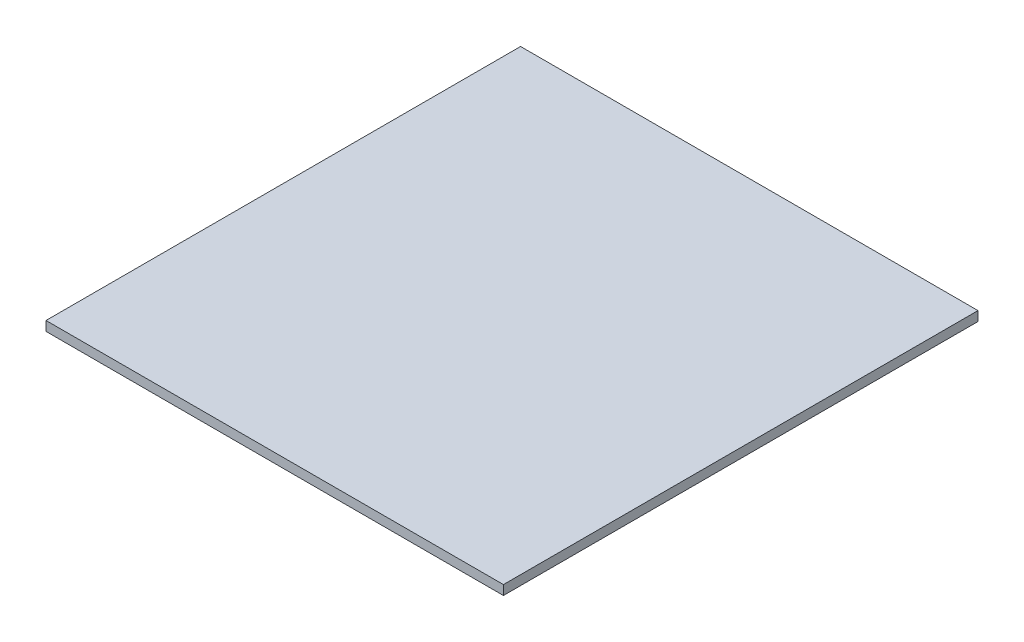
ISO-10303-21;
HEADER;
FILE_DESCRIPTION(('STEP AP214'),'2;1');
FILE_NAME('part.step','',(''),(''),'','','');
FILE_SCHEMA(('AUTOMOTIVE_DESIGN { 1 0 10303 214 1 1 1 1 }'));
ENDSEC;
DATA;
#1=APPLICATION_CONTEXT('core data for automotive mechanical design processes');
#2=APPLICATION_PROTOCOL_DEFINITION('international standard','automotive_design',2000,#1);
#3=PRODUCT_CONTEXT('',#1,'mechanical');
#4=PRODUCT('Part','Part','',(#3));
#5=PRODUCT_RELATED_PRODUCT_CATEGORY('part','',(#4));
#6=PRODUCT_DEFINITION_FORMATION('','',#4);
#7=PRODUCT_DEFINITION_CONTEXT('part definition',#1,'design');
#8=PRODUCT_DEFINITION('design','',#6,#7);
#9=PRODUCT_DEFINITION_SHAPE('','',#8);
#10=(LENGTH_UNIT() NAMED_UNIT(*) SI_UNIT(.MILLI.,.METRE.));
#11=(NAMED_UNIT(*) PLANE_ANGLE_UNIT() SI_UNIT($,.RADIAN.));
#12=(NAMED_UNIT(*) SI_UNIT($,.STERADIAN.) SOLID_ANGLE_UNIT());
#13=UNCERTAINTY_MEASURE_WITH_UNIT(LENGTH_MEASURE(1.E-05),#10,'distance_accuracy_value','');
#14=(GEOMETRIC_REPRESENTATION_CONTEXT(3) GLOBAL_UNCERTAINTY_ASSIGNED_CONTEXT((#13)) GLOBAL_UNIT_ASSIGNED_CONTEXT((#10,
#11,#12)) REPRESENTATION_CONTEXT('',''));
#15=CARTESIAN_POINT('',(0.,0.,0.));
#16=DIRECTION('',(0.,0.,1.));
#17=DIRECTION('',(1.,0.,0.));
#18=AXIS2_PLACEMENT_3D('',#15,#16,#17);
#19=CARTESIAN_POINT('',(0.,0.,150.));
#20=DIRECTION('',(1.,0.,0.));
#21=DIRECTION('',(0.,0.,-1.));
#22=AXIS2_PLACEMENT_3D('',#19,#20,#21);
#23=PLANE('',#22);
#24=DIRECTION('',(0.,-1.,0.));
#25=VECTOR('',#24,1.);
#26=CARTESIAN_POINT('',(0.,0.,0.));
#27=LINE('',#26,#25);
#28=CARTESIAN_POINT('',(0.,0.,0.));
#29=VERTEX_POINT('',#28);
#30=CARTESIAN_POINT('',(0.,-3.,0.));
#31=VERTEX_POINT('',#30);
#32=EDGE_CURVE('E107',#29,#31,#27,.T.);
#33=ORIENTED_EDGE('',*,*,#32,.T.);
#34=DIRECTION('',(0.,0.,-1.));
#35=VECTOR('',#34,1.);
#36=CARTESIAN_POINT('',(0.,-3.,150.));
#37=LINE('',#36,#35);
#38=CARTESIAN_POINT('',(0.,-3.,150.));
#39=VERTEX_POINT('',#38);
#40=EDGE_CURVE('E11',#39,#31,#37,.T.);
#41=ORIENTED_EDGE('',*,*,#40,.F.);
#42=DIRECTION('',(0.,-1.,0.));
#43=VECTOR('',#42,1.);
#44=CARTESIAN_POINT('',(0.,0.,150.));
#45=LINE('',#44,#43);
#46=CARTESIAN_POINT('',(0.,0.,150.));
#47=VERTEX_POINT('',#46);
#48=EDGE_CURVE('E91',#47,#39,#45,.T.);
#49=ORIENTED_EDGE('',*,*,#48,.F.);
#50=DIRECTION('',(0.,0.,-1.));
#51=VECTOR('',#50,1.);
#52=CARTESIAN_POINT('',(0.,0.,150.));
#53=LINE('',#52,#51);
#54=EDGE_CURVE('E103',#47,#29,#53,.T.);
#55=ORIENTED_EDGE('',*,*,#54,.T.);
#56=EDGE_LOOP('',(#33,#41,#49,#55));
#57=FACE_BOUND('',#56,.T.);
#58=ADVANCED_FACE('F39',(#57),#23,.F.);
#59=CARTESIAN_POINT('',(0.,-3.,150.));
#60=DIRECTION('',(0.,1.,0.));
#61=DIRECTION('',(0.,0.,1.));
#62=AXIS2_PLACEMENT_3D('',#59,#60,#61);
#63=PLANE('',#62);
#64=DIRECTION('',(1.,0.,0.));
#65=VECTOR('',#64,1.);
#66=CARTESIAN_POINT('',(0.,-3.,0.));
#67=LINE('',#66,#65);
#68=CARTESIAN_POINT('',(144.58,-3.,0.));
#69=VERTEX_POINT('',#68);
#70=EDGE_CURVE('E96',#31,#69,#67,.T.);
#71=ORIENTED_EDGE('',*,*,#70,.T.);
#72=DIRECTION('',(0.,0.,-1.));
#73=VECTOR('',#72,1.);
#74=CARTESIAN_POINT('',(144.58,-3.,150.));
#75=LINE('',#74,#73);
#76=CARTESIAN_POINT('',(144.58,-3.,150.));
#77=VERTEX_POINT('',#76);
#78=EDGE_CURVE('E48',#77,#69,#75,.T.);
#79=ORIENTED_EDGE('',*,*,#78,.F.);
#80=DIRECTION('',(1.,0.,0.));
#81=VECTOR('',#80,1.);
#82=CARTESIAN_POINT('',(0.,-3.,150.));
#83=LINE('',#82,#81);
#84=EDGE_CURVE('E86',#39,#77,#83,.T.);
#85=ORIENTED_EDGE('',*,*,#84,.F.);
#86=ORIENTED_EDGE('',*,*,#40,.T.);
#87=EDGE_LOOP('',(#71,#79,#85,#86));
#88=FACE_BOUND('',#87,.T.);
#89=ADVANCED_FACE('F95',(#88),#63,.F.);
#90=CARTESIAN_POINT('',(144.58,0.,150.));
#91=DIRECTION('',(-1.,0.,0.));
#92=DIRECTION('',(0.,0.,1.));
#93=AXIS2_PLACEMENT_3D('',#90,#91,#92);
#94=PLANE('',#93);
#95=DIRECTION('',(0.,1.,0.));
#96=VECTOR('',#95,1.);
#97=CARTESIAN_POINT('',(144.58,0.,0.));
#98=LINE('',#97,#96);
#99=CARTESIAN_POINT('',(144.58,0.,0.));
#100=VERTEX_POINT('',#99);
#101=EDGE_CURVE('E73',#69,#100,#98,.T.);
#102=ORIENTED_EDGE('',*,*,#101,.T.);
#103=DIRECTION('',(0.,0.,-1.));
#104=VECTOR('',#103,1.);
#105=CARTESIAN_POINT('',(144.58,0.,150.));
#106=LINE('',#105,#104);
#107=CARTESIAN_POINT('',(144.58,0.,150.));
#108=VERTEX_POINT('',#107);
#109=EDGE_CURVE('E98',#108,#100,#106,.T.);
#110=ORIENTED_EDGE('',*,*,#109,.F.);
#111=DIRECTION('',(0.,1.,0.));
#112=VECTOR('',#111,1.);
#113=CARTESIAN_POINT('',(144.58,0.,150.));
#114=LINE('',#113,#112);
#115=EDGE_CURVE('E89',#77,#108,#114,.T.);
#116=ORIENTED_EDGE('',*,*,#115,.F.);
#117=ORIENTED_EDGE('',*,*,#78,.T.);
#118=EDGE_LOOP('',(#102,#110,#116,#117));
#119=FACE_BOUND('',#118,.T.);
#120=ADVANCED_FACE('F99',(#119),#94,.F.);
#121=CARTESIAN_POINT('',(0.,0.,150.));
#122=DIRECTION('',(0.,-1.,0.));
#123=DIRECTION('',(0.,0.,-1.));
#124=AXIS2_PLACEMENT_3D('',#121,#122,#123);
#125=PLANE('',#124);
#126=DIRECTION('',(-1.,0.,0.));
#127=VECTOR('',#126,1.);
#128=CARTESIAN_POINT('',(0.,0.,0.));
#129=LINE('',#128,#127);
#130=EDGE_CURVE('E79',#100,#29,#129,.T.);
#131=ORIENTED_EDGE('',*,*,#130,.T.);
#132=ORIENTED_EDGE('',*,*,#54,.F.);
#133=DIRECTION('',(-1.,0.,0.));
#134=VECTOR('',#133,1.);
#135=CARTESIAN_POINT('',(0.,0.,150.));
#136=LINE('',#135,#134);
#137=EDGE_CURVE('E56',#108,#47,#136,.T.);
#138=ORIENTED_EDGE('',*,*,#137,.F.);
#139=ORIENTED_EDGE('',*,*,#109,.T.);
#140=EDGE_LOOP('',(#131,#132,#138,#139));
#141=FACE_BOUND('',#140,.T.);
#142=ADVANCED_FACE('F120',(#141),#125,.F.);
#143=CARTESIAN_POINT('',(0.,0.,150.));
#144=DIRECTION('',(0.,0.,1.));
#145=DIRECTION('',(1.,0.,0.));
#146=AXIS2_PLACEMENT_3D('',#143,#144,#145);
#147=PLANE('',#146);
#148=ORIENTED_EDGE('',*,*,#48,.T.);
#149=ORIENTED_EDGE('',*,*,#84,.T.);
#150=ORIENTED_EDGE('',*,*,#115,.T.);
#151=ORIENTED_EDGE('',*,*,#137,.T.);
#152=EDGE_LOOP('',(#148,#149,#150,#151));
#153=FACE_BOUND('',#152,.T.);
#154=ADVANCED_FACE('F87',(#153),#147,.T.);
#155=CARTESIAN_POINT('',(0.,0.,0.));
#156=DIRECTION('',(0.,0.,1.));
#157=DIRECTION('',(1.,0.,0.));
#158=AXIS2_PLACEMENT_3D('',#155,#156,#157);
#159=PLANE('',#158);
#160=ORIENTED_EDGE('',*,*,#32,.F.);
#161=ORIENTED_EDGE('',*,*,#130,.F.);
#162=ORIENTED_EDGE('',*,*,#101,.F.);
#163=ORIENTED_EDGE('',*,*,#70,.F.);
#164=EDGE_LOOP('',(#160,#161,#162,#163));
#165=FACE_BOUND('',#164,.T.);
#166=ADVANCED_FACE('F123',(#165),#159,.F.);
#167=CLOSED_SHELL('',(#58,#89,#120,#142,#154,#166));
#168=MANIFOLD_SOLID_BREP('B2',#167);
#169=ADVANCED_BREP_SHAPE_REPRESENTATION('',(#18,#168),#14);
#170=SHAPE_DEFINITION_REPRESENTATION(#9,#169);
ENDSEC;
END-ISO-10303-21;
